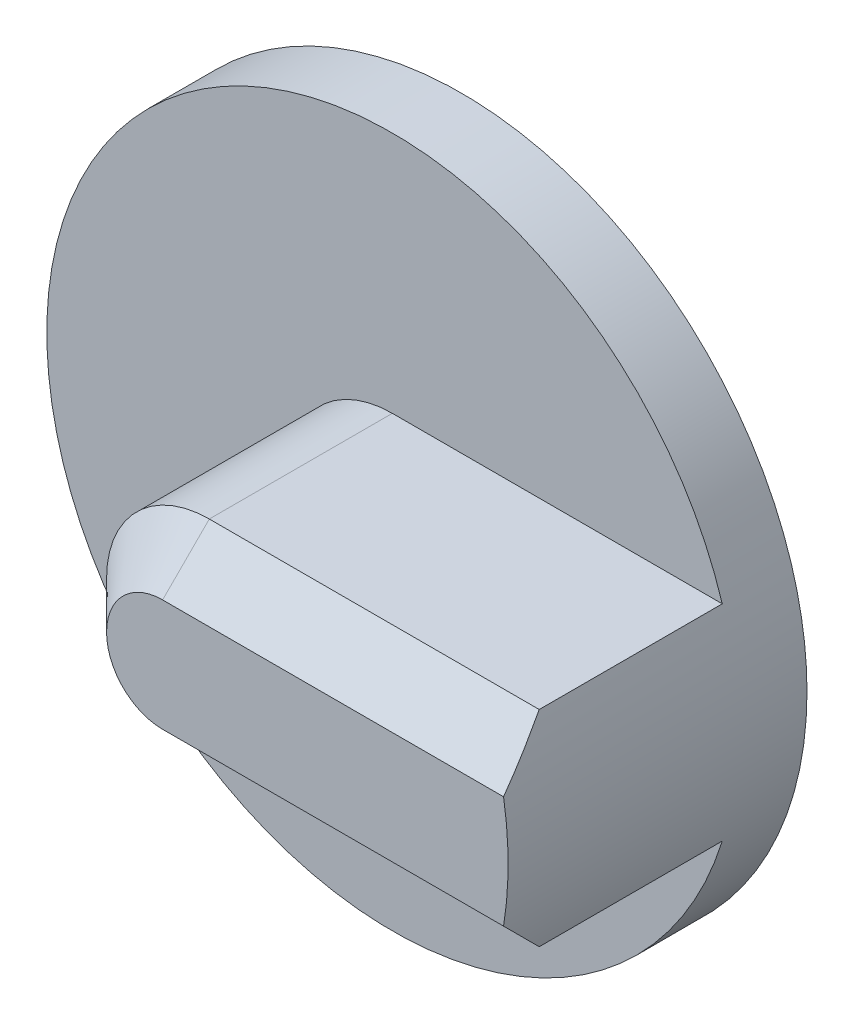
ISO-10303-21;
HEADER;
FILE_DESCRIPTION(('STEP AP214'),'2;1');
FILE_NAME('part.step','',(''),(''),'','','');
FILE_SCHEMA(('AUTOMOTIVE_DESIGN { 1 0 10303 214 1 1 1 1 }'));
ENDSEC;
DATA;
#1=APPLICATION_CONTEXT('core data for automotive mechanical design processes');
#2=APPLICATION_PROTOCOL_DEFINITION('international standard','automotive_design',2000,#1);
#3=PRODUCT_CONTEXT('',#1,'mechanical');
#4=PRODUCT('Part','Part','',(#3));
#5=PRODUCT_RELATED_PRODUCT_CATEGORY('part','',(#4));
#6=PRODUCT_DEFINITION_FORMATION('','',#4);
#7=PRODUCT_DEFINITION_CONTEXT('part definition',#1,'design');
#8=PRODUCT_DEFINITION('design','',#6,#7);
#9=PRODUCT_DEFINITION_SHAPE('','',#8);
#10=(LENGTH_UNIT() NAMED_UNIT(*) SI_UNIT(.MILLI.,.METRE.));
#11=(NAMED_UNIT(*) PLANE_ANGLE_UNIT() SI_UNIT($,.RADIAN.));
#12=(NAMED_UNIT(*) SI_UNIT($,.STERADIAN.) SOLID_ANGLE_UNIT());
#13=UNCERTAINTY_MEASURE_WITH_UNIT(LENGTH_MEASURE(1.E-05),#10,'distance_accuracy_value','');
#14=(GEOMETRIC_REPRESENTATION_CONTEXT(3) GLOBAL_UNCERTAINTY_ASSIGNED_CONTEXT((#13)) GLOBAL_UNIT_ASSIGNED_CONTEXT((#10,
#11,#12)) REPRESENTATION_CONTEXT('',''));
#15=CARTESIAN_POINT('',(0.,0.,0.));
#16=DIRECTION('',(0.,0.,1.));
#17=DIRECTION('',(1.,0.,0.));
#18=AXIS2_PLACEMENT_3D('',#15,#16,#17);
#19=CARTESIAN_POINT('',(0.,0.,172.051803615609));
#20=DIRECTION('',(0.,0.,-1.));
#21=DIRECTION('',(-1.,0.,0.));
#22=AXIS2_PLACEMENT_3D('',#19,#20,#21);
#23=CYLINDRICAL_SURFACE('',#22,37.);
#24=CARTESIAN_POINT('',(0.,0.,60.));
#25=DIRECTION('',(0.,0.,1.));
#26=DIRECTION('',(1.,0.,0.));
#27=AXIS2_PLACEMENT_3D('',#24,#25,#26);
#28=CIRCLE('',#27,37.);
#29=CARTESIAN_POINT('',(37.,0.,60.));
#30=VERTEX_POINT('',#29);
#31=EDGE_CURVE('E108',#30,#30,#28,.T.);
#32=ORIENTED_EDGE('',*,*,#31,.T.);
#33=EDGE_LOOP('',(#32));
#34=FACE_BOUND('',#33,.T.);
#35=DIRECTION('',(0.,0.,-1.));
#36=VECTOR('',#35,1.);
#37=CARTESIAN_POINT('',(35.3270434653114,11.,236.801515129776));
#38=LINE('',#37,#36);
#39=CARTESIAN_POINT('',(35.3270434653114,11.,87.));
#40=VERTEX_POINT('',#39);
#41=CARTESIAN_POINT('',(35.3270434653114,11.,67.4));
#42=VERTEX_POINT('',#41);
#43=EDGE_CURVE('E96',#40,#42,#38,.T.);
#44=ORIENTED_EDGE('',*,*,#43,.F.);
#45=CARTESIAN_POINT('',(0.,0.,98.));
#46=DIRECTION('',(0.,-0.707106781186546,-0.707106781186549));
#47=DIRECTION('',(0.,0.707106781186549,-0.707106781186546));
#48=AXIS2_PLACEMENT_3D('',#45,#46,#47);
#49=ELLIPSE('',#48,52.3259018078044,37.);
#50=CARTESIAN_POINT('',(36.5102725270574,6.,92.));
#51=VERTEX_POINT('',#50);
#52=EDGE_CURVE('E127',#40,#51,#49,.T.);
#53=ORIENTED_EDGE('',*,*,#52,.T.);
#54=CARTESIAN_POINT('',(0.,0.,92.));
#55=DIRECTION('',(0.,0.,-1.));
#56=DIRECTION('',(-1.,0.,0.));
#57=AXIS2_PLACEMENT_3D('',#54,#55,#56);
#58=CIRCLE('',#57,37.);
#59=CARTESIAN_POINT('',(36.5102725270574,-6.,92.));
#60=VERTEX_POINT('',#59);
#61=EDGE_CURVE('E121',#51,#60,#58,.T.);
#62=ORIENTED_EDGE('',*,*,#61,.T.);
#63=CARTESIAN_POINT('',(0.,0.,98.));
#64=DIRECTION('',(0.,0.707106781186546,-0.707106781186549));
#65=DIRECTION('',(0.,-0.707106781186549,-0.707106781186546));
#66=AXIS2_PLACEMENT_3D('',#63,#64,#65);
#67=ELLIPSE('',#66,52.3259018078044,37.);
#68=CARTESIAN_POINT('',(35.3270434653114,-11.,87.));
#69=VERTEX_POINT('',#68);
#70=EDGE_CURVE('E93',#60,#69,#67,.T.);
#71=ORIENTED_EDGE('',*,*,#70,.T.);
#72=DIRECTION('',(0.,0.,-1.));
#73=VECTOR('',#72,1.);
#74=CARTESIAN_POINT('',(35.3270434653114,-11.,236.801515129776));
#75=LINE('',#74,#73);
#76=CARTESIAN_POINT('',(35.3270434653114,-11.,67.4));
#77=VERTEX_POINT('',#76);
#78=EDGE_CURVE('E87',#69,#77,#75,.T.);
#79=ORIENTED_EDGE('',*,*,#78,.T.);
#80=CARTESIAN_POINT('',(0.,0.,67.4));
#81=DIRECTION('',(0.,0.,1.));
#82=DIRECTION('',(1.,0.,0.));
#83=AXIS2_PLACEMENT_3D('',#80,#81,#82);
#84=CIRCLE('',#83,37.);
#85=EDGE_CURVE('E90',#42,#77,#84,.T.);
#86=ORIENTED_EDGE('',*,*,#85,.F.);
#87=EDGE_LOOP('',(#44,#53,#62,#71,#79,#86));
#88=FACE_BOUND('',#87,.T.);
#89=ADVANCED_FACE('F33',(#34,#88),#23,.T.);
#90=CARTESIAN_POINT('',(0.,0.,60.));
#91=DIRECTION('',(0.,0.,1.));
#92=DIRECTION('',(1.,0.,0.));
#93=AXIS2_PLACEMENT_3D('',#90,#91,#92);
#94=PLANE('',#93);
#95=ORIENTED_EDGE('',*,*,#31,.F.);
#96=EDGE_LOOP('',(#95));
#97=FACE_BOUND('',#96,.T.);
#98=ADVANCED_FACE('F163',(#97),#94,.F.);
#99=CARTESIAN_POINT('',(-24.593036380232,21.345003768468,67.4));
#100=DIRECTION('',(0.,0.,1.));
#101=DIRECTION('',(1.,0.,0.));
#102=AXIS2_PLACEMENT_3D('',#99,#100,#101);
#103=PLANE('',#102);
#104=DIRECTION('',(-1.,0.,0.));
#105=VECTOR('',#104,1.);
#106=CARTESIAN_POINT('',(0.,11.,67.4));
#107=LINE('',#106,#105);
#108=CARTESIAN_POINT('',(0.,11.,67.4));
#109=VERTEX_POINT('',#108);
#110=EDGE_CURVE('E106',#42,#109,#107,.T.);
#111=ORIENTED_EDGE('',*,*,#110,.F.);
#112=ORIENTED_EDGE('',*,*,#85,.T.);
#113=DIRECTION('',(1.,0.,0.));
#114=VECTOR('',#113,1.);
#115=CARTESIAN_POINT('',(0.,-11.,67.4));
#116=LINE('',#115,#114);
#117=CARTESIAN_POINT('',(0.,-11.,67.4));
#118=VERTEX_POINT('',#117);
#119=EDGE_CURVE('E103',#118,#77,#116,.T.);
#120=ORIENTED_EDGE('',*,*,#119,.F.);
#121=CARTESIAN_POINT('',(0.,0.,67.4));
#122=DIRECTION('',(0.,0.,1.));
#123=DIRECTION('',(1.,0.,0.));
#124=AXIS2_PLACEMENT_3D('',#121,#122,#123);
#125=CIRCLE('',#124,11.);
#126=EDGE_CURVE('E111',#109,#118,#125,.T.);
#127=ORIENTED_EDGE('',*,*,#126,.F.);
#128=EDGE_LOOP('',(#111,#112,#120,#127));
#129=FACE_BOUND('',#128,.T.);
#130=ADVANCED_FACE('F101',(#129),#103,.T.);
#131=CARTESIAN_POINT('',(0.,11.,236.801515129776));
#132=DIRECTION('',(0.,-1.,0.));
#133=DIRECTION('',(0.,0.,-1.));
#134=AXIS2_PLACEMENT_3D('',#131,#132,#133);
#135=PLANE('',#134);
#136=DIRECTION('',(0.,0.,-1.));
#137=VECTOR('',#136,1.);
#138=CARTESIAN_POINT('',(0.,11.,236.801515129776));
#139=LINE('',#138,#137);
#140=CARTESIAN_POINT('',(0.,11.,87.));
#141=VERTEX_POINT('',#140);
#142=EDGE_CURVE('E113',#141,#109,#139,.T.);
#143=ORIENTED_EDGE('',*,*,#142,.F.);
#144=DIRECTION('',(1.,0.,0.));
#145=VECTOR('',#144,1.);
#146=CARTESIAN_POINT('',(0.,11.,87.));
#147=LINE('',#146,#145);
#148=EDGE_CURVE('E107',#141,#40,#147,.T.);
#149=ORIENTED_EDGE('',*,*,#148,.T.);
#150=ORIENTED_EDGE('',*,*,#43,.T.);
#151=ORIENTED_EDGE('',*,*,#110,.T.);
#152=EDGE_LOOP('',(#143,#149,#150,#151));
#153=FACE_BOUND('',#152,.T.);
#154=ADVANCED_FACE('F150',(#153),#135,.F.);
#155=CARTESIAN_POINT('',(0.,-11.,236.801515129776));
#156=DIRECTION('',(0.,1.,0.));
#157=DIRECTION('',(0.,0.,1.));
#158=AXIS2_PLACEMENT_3D('',#155,#156,#157);
#159=PLANE('',#158);
#160=ORIENTED_EDGE('',*,*,#78,.F.);
#161=DIRECTION('',(-1.,0.,0.));
#162=VECTOR('',#161,1.);
#163=CARTESIAN_POINT('',(0.,-11.,87.));
#164=LINE('',#163,#162);
#165=CARTESIAN_POINT('',(0.,-11.,87.));
#166=VERTEX_POINT('',#165);
#167=EDGE_CURVE('E11',#69,#166,#164,.T.);
#168=ORIENTED_EDGE('',*,*,#167,.T.);
#169=DIRECTION('',(0.,0.,-1.));
#170=VECTOR('',#169,1.);
#171=CARTESIAN_POINT('',(0.,-11.,236.801515129776));
#172=LINE('',#171,#170);
#173=EDGE_CURVE('E95',#166,#118,#172,.T.);
#174=ORIENTED_EDGE('',*,*,#173,.T.);
#175=ORIENTED_EDGE('',*,*,#119,.T.);
#176=EDGE_LOOP('',(#160,#168,#174,#175));
#177=FACE_BOUND('',#176,.T.);
#178=ADVANCED_FACE('F110',(#177),#159,.F.);
#179=CARTESIAN_POINT('',(0.,0.,236.801515129776));
#180=DIRECTION('',(0.,0.,-1.));
#181=DIRECTION('',(-1.,0.,0.));
#182=AXIS2_PLACEMENT_3D('',#179,#180,#181);
#183=CYLINDRICAL_SURFACE('',#182,11.);
#184=ORIENTED_EDGE('',*,*,#173,.F.);
#185=CARTESIAN_POINT('',(0.,0.,87.));
#186=DIRECTION('',(0.,0.,-1.));
#187=DIRECTION('',(-1.,0.,0.));
#188=AXIS2_PLACEMENT_3D('',#185,#186,#187);
#189=CIRCLE('',#188,11.);
#190=EDGE_CURVE('E42',#166,#141,#189,.T.);
#191=ORIENTED_EDGE('',*,*,#190,.T.);
#192=ORIENTED_EDGE('',*,*,#142,.T.);
#193=ORIENTED_EDGE('',*,*,#126,.T.);
#194=EDGE_LOOP('',(#184,#191,#192,#193));
#195=FACE_BOUND('',#194,.T.);
#196=ADVANCED_FACE('F152',(#195),#183,.T.);
#197=CARTESIAN_POINT('',(0.,0.,92.));
#198=DIRECTION('',(0.,0.,-1.));
#199=DIRECTION('',(0.,-1.,0.));
#200=AXIS2_PLACEMENT_3D('',#197,#198,#199);
#201=PLANE('',#200);
#202=ORIENTED_EDGE('',*,*,#61,.F.);
#203=DIRECTION('',(-1.,0.,0.));
#204=VECTOR('',#203,1.);
#205=CARTESIAN_POINT('',(0.,6.,92.));
#206=LINE('',#205,#204);
#207=CARTESIAN_POINT('',(0.,5.99999999999999,92.));
#208=VERTEX_POINT('',#207);
#209=EDGE_CURVE('E56',#51,#208,#206,.T.);
#210=ORIENTED_EDGE('',*,*,#209,.T.);
#211=CARTESIAN_POINT('',(0.,0.,92.));
#212=DIRECTION('',(0.,0.,-1.));
#213=DIRECTION('',(-1.,0.,0.));
#214=AXIS2_PLACEMENT_3D('',#211,#212,#213);
#215=CIRCLE('',#214,5.99999999999999);
#216=CARTESIAN_POINT('',(0.,-6.,92.));
#217=VERTEX_POINT('',#216);
#218=EDGE_CURVE('E131',#208,#217,#215,.F.);
#219=ORIENTED_EDGE('',*,*,#218,.T.);
#220=DIRECTION('',(1.,0.,0.));
#221=VECTOR('',#220,1.);
#222=CARTESIAN_POINT('',(0.,-6.,92.));
#223=LINE('',#222,#221);
#224=EDGE_CURVE('E129',#217,#60,#223,.T.);
#225=ORIENTED_EDGE('',*,*,#224,.T.);
#226=EDGE_LOOP('',(#202,#210,#219,#225));
#227=FACE_BOUND('',#226,.T.);
#228=ADVANCED_FACE('F146',(#227),#201,.F.);
#229=CARTESIAN_POINT('',(0.,-11.,87.));
#230=DIRECTION('',(0.,0.707106781186546,-0.707106781186549));
#231=DIRECTION('',(-1.,0.,0.));
#232=AXIS2_PLACEMENT_3D('',#229,#230,#231);
#233=PLANE('',#232);
#234=ORIENTED_EDGE('',*,*,#70,.F.);
#235=ORIENTED_EDGE('',*,*,#224,.F.);
#236=DIRECTION('',(0.,0.707106781186549,0.707106781186546));
#237=VECTOR('',#236,1.);
#238=CARTESIAN_POINT('',(0.,-11.,87.));
#239=LINE('',#238,#237);
#240=EDGE_CURVE('E37',#166,#217,#239,.T.);
#241=ORIENTED_EDGE('',*,*,#240,.F.);
#242=ORIENTED_EDGE('',*,*,#167,.F.);
#243=EDGE_LOOP('',(#234,#235,#241,#242));
#244=FACE_BOUND('',#243,.T.);
#245=ADVANCED_FACE('F35',(#244),#233,.F.);
#246=CARTESIAN_POINT('',(0.,0.,87.));
#247=DIRECTION('',(0.,0.,-1.));
#248=DIRECTION('',(-1.,0.,0.));
#249=AXIS2_PLACEMENT_3D('',#246,#247,#248);
#250=CONICAL_SURFACE('',#249,11.,0.785398163397451);
#251=ORIENTED_EDGE('',*,*,#240,.T.);
#252=ORIENTED_EDGE('',*,*,#218,.F.);
#253=DIRECTION('',(0.,-0.70710678118655,0.707106781186546));
#254=VECTOR('',#253,1.);
#255=CARTESIAN_POINT('',(0.,11.,87.));
#256=LINE('',#255,#254);
#257=EDGE_CURVE('E134',#141,#208,#256,.T.);
#258=ORIENTED_EDGE('',*,*,#257,.F.);
#259=ORIENTED_EDGE('',*,*,#190,.F.);
#260=EDGE_LOOP('',(#251,#252,#258,#259));
#261=FACE_BOUND('',#260,.T.);
#262=ADVANCED_FACE('F143',(#261),#250,.T.);
#263=CARTESIAN_POINT('',(0.,11.,87.));
#264=DIRECTION('',(0.,-0.707106781186546,-0.707106781186549));
#265=DIRECTION('',(1.,0.,0.));
#266=AXIS2_PLACEMENT_3D('',#263,#264,#265);
#267=PLANE('',#266);
#268=ORIENTED_EDGE('',*,*,#257,.T.);
#269=ORIENTED_EDGE('',*,*,#209,.F.);
#270=ORIENTED_EDGE('',*,*,#52,.F.);
#271=ORIENTED_EDGE('',*,*,#148,.F.);
#272=EDGE_LOOP('',(#268,#269,#270,#271));
#273=FACE_BOUND('',#272,.T.);
#274=ADVANCED_FACE('F147',(#273),#267,.F.);
#275=CLOSED_SHELL('',(#89,#98,#130,#154,#178,#196,#228,#245,#262,#274));
#276=MANIFOLD_SOLID_BREP('B2',#275);
#277=ADVANCED_BREP_SHAPE_REPRESENTATION('',(#18,#276),#14);
#278=SHAPE_DEFINITION_REPRESENTATION(#9,#277);
ENDSEC;
END-ISO-10303-21;
